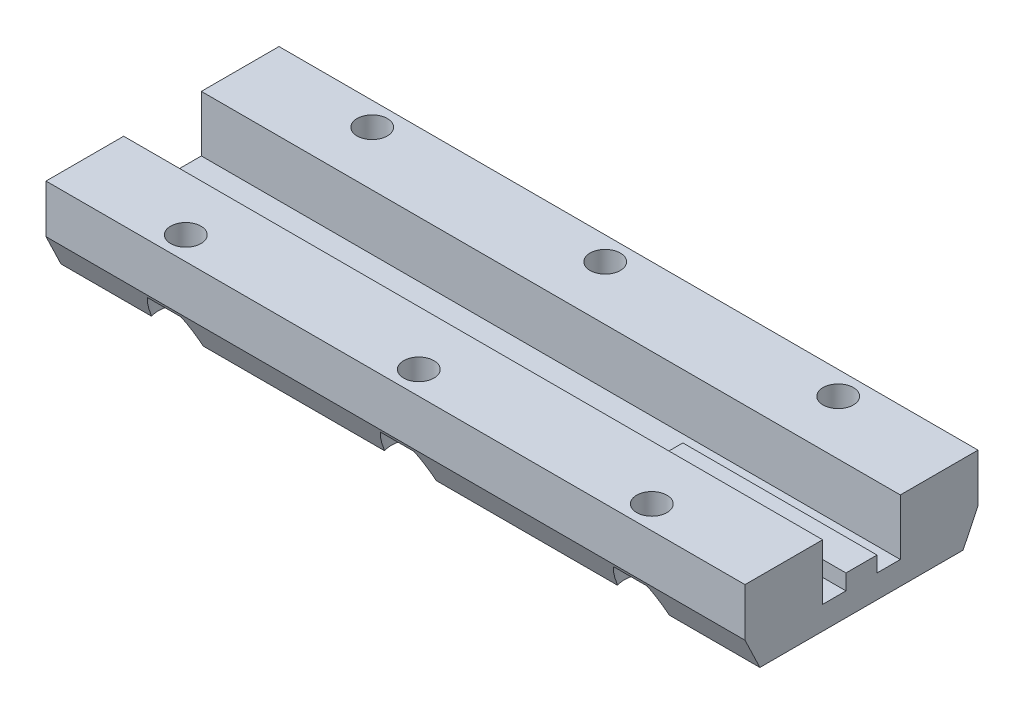
ISO-10303-21;
HEADER;
FILE_DESCRIPTION(('STEP AP214'),'2;1');
FILE_NAME('part.step','',(''),(''),'','','');
FILE_SCHEMA(('AUTOMOTIVE_DESIGN { 1 0 10303 214 1 1 1 1 }'));
ENDSEC;
DATA;
#1=APPLICATION_CONTEXT('core data for automotive mechanical design processes');
#2=APPLICATION_PROTOCOL_DEFINITION('international standard','automotive_design',2000,#1);
#3=PRODUCT_CONTEXT('',#1,'mechanical');
#4=PRODUCT('Part','Part','',(#3));
#5=PRODUCT_RELATED_PRODUCT_CATEGORY('part','',(#4));
#6=PRODUCT_DEFINITION_FORMATION('','',#4);
#7=PRODUCT_DEFINITION_CONTEXT('part definition',#1,'design');
#8=PRODUCT_DEFINITION('design','',#6,#7);
#9=PRODUCT_DEFINITION_SHAPE('','',#8);
#10=(LENGTH_UNIT() NAMED_UNIT(*) SI_UNIT(.MILLI.,.METRE.));
#11=(NAMED_UNIT(*) PLANE_ANGLE_UNIT() SI_UNIT($,.RADIAN.));
#12=(NAMED_UNIT(*) SI_UNIT($,.STERADIAN.) SOLID_ANGLE_UNIT());
#13=UNCERTAINTY_MEASURE_WITH_UNIT(LENGTH_MEASURE(1.E-05),#10,'distance_accuracy_value','');
#14=(GEOMETRIC_REPRESENTATION_CONTEXT(3) GLOBAL_UNCERTAINTY_ASSIGNED_CONTEXT((#13)) GLOBAL_UNIT_ASSIGNED_CONTEXT((#10,
#11,#12)) REPRESENTATION_CONTEXT('',''));
#15=CARTESIAN_POINT('',(0.,0.,0.));
#16=DIRECTION('',(0.,0.,1.));
#17=DIRECTION('',(1.,0.,0.));
#18=AXIS2_PLACEMENT_3D('',#15,#16,#17);
#19=CARTESIAN_POINT('',(45.,0.,-12.));
#20=DIRECTION('',(0.,-1.,0.));
#21=DIRECTION('',(0.,0.,-1.));
#22=AXIS2_PLACEMENT_3D('',#19,#20,#21);
#23=CYLINDRICAL_SURFACE('',#22,1.95);
#24=CARTESIAN_POINT('',(45.,0.,-12.));
#25=DIRECTION('',(0.,-1.,0.));
#26=DIRECTION('',(0.,0.,-1.));
#27=AXIS2_PLACEMENT_3D('',#24,#25,#26);
#28=CIRCLE('',#27,1.95);
#29=CARTESIAN_POINT('',(45.,0.,-13.95));
#30=VERTEX_POINT('',#29);
#31=EDGE_CURVE('E451',#30,#30,#28,.F.);
#32=ORIENTED_EDGE('',*,*,#31,.T.);
#33=EDGE_LOOP('',(#32));
#34=FACE_BOUND('',#33,.T.);
#35=CARTESIAN_POINT('',(45.,-6.7,-12.));
#36=DIRECTION('',(0.,-1.,0.));
#37=DIRECTION('',(0.,0.,-1.));
#38=AXIS2_PLACEMENT_3D('',#35,#36,#37);
#39=CIRCLE('',#38,1.95);
#40=CARTESIAN_POINT('',(45.,-6.7,-13.95));
#41=VERTEX_POINT('',#40);
#42=EDGE_CURVE('E37',#41,#41,#39,.T.);
#43=ORIENTED_EDGE('',*,*,#42,.T.);
#44=EDGE_LOOP('',(#43));
#45=FACE_BOUND('',#44,.T.);
#46=ADVANCED_FACE('F33',(#34,#45),#23,.F.);
#47=CARTESIAN_POINT('',(75.,0.,-12.));
#48=DIRECTION('',(0.,-1.,0.));
#49=DIRECTION('',(0.,0.,-1.));
#50=AXIS2_PLACEMENT_3D('',#47,#48,#49);
#51=CYLINDRICAL_SURFACE('',#50,1.95);
#52=CARTESIAN_POINT('',(75.,0.,-12.));
#53=DIRECTION('',(0.,-1.,0.));
#54=DIRECTION('',(0.,0.,-1.));
#55=AXIS2_PLACEMENT_3D('',#52,#53,#54);
#56=CIRCLE('',#55,1.95);
#57=CARTESIAN_POINT('',(75.,0.,-13.95));
#58=VERTEX_POINT('',#57);
#59=EDGE_CURVE('E446',#58,#58,#56,.F.);
#60=ORIENTED_EDGE('',*,*,#59,.T.);
#61=EDGE_LOOP('',(#60));
#62=FACE_BOUND('',#61,.T.);
#63=CARTESIAN_POINT('',(75.,-6.7,-12.));
#64=DIRECTION('',(0.,-1.,0.));
#65=DIRECTION('',(0.,0.,-1.));
#66=AXIS2_PLACEMENT_3D('',#63,#64,#65);
#67=CIRCLE('',#66,1.95);
#68=CARTESIAN_POINT('',(75.,-6.7,-13.95));
#69=VERTEX_POINT('',#68);
#70=EDGE_CURVE('E314',#69,#69,#67,.T.);
#71=ORIENTED_EDGE('',*,*,#70,.T.);
#72=EDGE_LOOP('',(#71));
#73=FACE_BOUND('',#72,.T.);
#74=ADVANCED_FACE('F518',(#62,#73),#51,.F.);
#75=CARTESIAN_POINT('',(75.,0.,12.));
#76=DIRECTION('',(0.,-1.,0.));
#77=DIRECTION('',(0.,0.,-1.));
#78=AXIS2_PLACEMENT_3D('',#75,#76,#77);
#79=CYLINDRICAL_SURFACE('',#78,1.95);
#80=CARTESIAN_POINT('',(75.,0.,12.));
#81=DIRECTION('',(0.,-1.,0.));
#82=DIRECTION('',(0.,0.,-1.));
#83=AXIS2_PLACEMENT_3D('',#80,#81,#82);
#84=CIRCLE('',#83,1.95);
#85=CARTESIAN_POINT('',(75.,0.,10.05));
#86=VERTEX_POINT('',#85);
#87=EDGE_CURVE('E359',#86,#86,#84,.T.);
#88=ORIENTED_EDGE('',*,*,#87,.F.);
#89=EDGE_LOOP('',(#88));
#90=FACE_BOUND('',#89,.T.);
#91=CARTESIAN_POINT('',(75.,-6.7,12.));
#92=DIRECTION('',(0.,-1.,0.));
#93=DIRECTION('',(0.,0.,-1.));
#94=AXIS2_PLACEMENT_3D('',#91,#92,#93);
#95=CIRCLE('',#94,1.95);
#96=CARTESIAN_POINT('',(75.,-6.7,10.05));
#97=VERTEX_POINT('',#96);
#98=EDGE_CURVE('E309',#97,#97,#95,.F.);
#99=ORIENTED_EDGE('',*,*,#98,.F.);
#100=EDGE_LOOP('',(#99));
#101=FACE_BOUND('',#100,.T.);
#102=ADVANCED_FACE('F524',(#90,#101),#79,.F.);
#103=CARTESIAN_POINT('',(45.,0.,12.));
#104=DIRECTION('',(0.,-1.,0.));
#105=DIRECTION('',(0.,0.,-1.));
#106=AXIS2_PLACEMENT_3D('',#103,#104,#105);
#107=CYLINDRICAL_SURFACE('',#106,1.95);
#108=CARTESIAN_POINT('',(45.,0.,12.));
#109=DIRECTION('',(0.,-1.,0.));
#110=DIRECTION('',(0.,0.,-1.));
#111=AXIS2_PLACEMENT_3D('',#108,#109,#110);
#112=CIRCLE('',#111,1.95);
#113=CARTESIAN_POINT('',(45.,0.,10.05));
#114=VERTEX_POINT('',#113);
#115=EDGE_CURVE('E354',#114,#114,#112,.T.);
#116=ORIENTED_EDGE('',*,*,#115,.F.);
#117=EDGE_LOOP('',(#116));
#118=FACE_BOUND('',#117,.T.);
#119=CARTESIAN_POINT('',(45.,-6.7,12.));
#120=DIRECTION('',(0.,-1.,0.));
#121=DIRECTION('',(0.,0.,-1.));
#122=AXIS2_PLACEMENT_3D('',#119,#120,#121);
#123=CIRCLE('',#122,1.95);
#124=CARTESIAN_POINT('',(45.,-6.7,10.05));
#125=VERTEX_POINT('',#124);
#126=EDGE_CURVE('E300',#125,#125,#123,.F.);
#127=ORIENTED_EDGE('',*,*,#126,.F.);
#128=EDGE_LOOP('',(#127));
#129=FACE_BOUND('',#128,.T.);
#130=ADVANCED_FACE('F567',(#118,#129),#107,.F.);
#131=CARTESIAN_POINT('',(15.,0.,-12.));
#132=DIRECTION('',(0.,-1.,0.));
#133=DIRECTION('',(0.,0.,-1.));
#134=AXIS2_PLACEMENT_3D('',#131,#132,#133);
#135=CYLINDRICAL_SURFACE('',#134,1.95);
#136=CARTESIAN_POINT('',(15.,0.,-12.));
#137=DIRECTION('',(0.,-1.,0.));
#138=DIRECTION('',(0.,0.,-1.));
#139=AXIS2_PLACEMENT_3D('',#136,#137,#138);
#140=CIRCLE('',#139,1.95);
#141=CARTESIAN_POINT('',(15.,0.,-13.95));
#142=VERTEX_POINT('',#141);
#143=EDGE_CURVE('E447',#142,#142,#140,.F.);
#144=ORIENTED_EDGE('',*,*,#143,.T.);
#145=EDGE_LOOP('',(#144));
#146=FACE_BOUND('',#145,.T.);
#147=CARTESIAN_POINT('',(15.,-6.7,-12.));
#148=DIRECTION('',(0.,-1.,0.));
#149=DIRECTION('',(0.,0.,-1.));
#150=AXIS2_PLACEMENT_3D('',#147,#148,#149);
#151=CIRCLE('',#150,1.95);
#152=CARTESIAN_POINT('',(15.,-6.7,-13.95));
#153=VERTEX_POINT('',#152);
#154=EDGE_CURVE('E295',#153,#153,#151,.T.);
#155=ORIENTED_EDGE('',*,*,#154,.T.);
#156=EDGE_LOOP('',(#155));
#157=FACE_BOUND('',#156,.T.);
#158=ADVANCED_FACE('F529',(#146,#157),#135,.F.);
#159=CARTESIAN_POINT('',(15.,0.,12.));
#160=DIRECTION('',(0.,-1.,0.));
#161=DIRECTION('',(0.,0.,-1.));
#162=AXIS2_PLACEMENT_3D('',#159,#160,#161);
#163=CYLINDRICAL_SURFACE('',#162,1.95);
#164=CARTESIAN_POINT('',(15.,0.,12.));
#165=DIRECTION('',(0.,-1.,0.));
#166=DIRECTION('',(0.,0.,-1.));
#167=AXIS2_PLACEMENT_3D('',#164,#165,#166);
#168=CIRCLE('',#167,1.95);
#169=CARTESIAN_POINT('',(15.,0.,10.05));
#170=VERTEX_POINT('',#169);
#171=EDGE_CURVE('E355',#170,#170,#168,.T.);
#172=ORIENTED_EDGE('',*,*,#171,.F.);
#173=EDGE_LOOP('',(#172));
#174=FACE_BOUND('',#173,.T.);
#175=CARTESIAN_POINT('',(15.,-6.7,12.));
#176=DIRECTION('',(0.,-1.,0.));
#177=DIRECTION('',(0.,0.,-1.));
#178=AXIS2_PLACEMENT_3D('',#175,#176,#177);
#179=CIRCLE('',#178,1.95);
#180=CARTESIAN_POINT('',(15.,-6.7,10.05));
#181=VERTEX_POINT('',#180);
#182=EDGE_CURVE('E287',#181,#181,#179,.F.);
#183=ORIENTED_EDGE('',*,*,#182,.F.);
#184=EDGE_LOOP('',(#183));
#185=FACE_BOUND('',#184,.T.);
#186=ADVANCED_FACE('F566',(#174,#185),#163,.F.);
#187=CARTESIAN_POINT('',(65.,-5.2,2.));
#188=DIRECTION('',(1.,0.,0.));
#189=DIRECTION('',(0.,0.,-1.));
#190=AXIS2_PLACEMENT_3D('',#187,#188,#189);
#191=PLANE('',#190);
#192=DIRECTION('',(0.,-1.,0.));
#193=VECTOR('',#192,1.);
#194=CARTESIAN_POINT('',(65.,-5.2,1.95));
#195=LINE('',#194,#193);
#196=CARTESIAN_POINT('',(65.,-7.2,1.95));
#197=VERTEX_POINT('',#196);
#198=CARTESIAN_POINT('',(65.,-10.2,1.95));
#199=VERTEX_POINT('',#198);
#200=EDGE_CURVE('E283',#197,#199,#195,.T.);
#201=ORIENTED_EDGE('',*,*,#200,.F.);
#202=DIRECTION('',(0.,0.,-1.));
#203=VECTOR('',#202,1.);
#204=CARTESIAN_POINT('',(65.,-7.2,2.));
#205=LINE('',#204,#203);
#206=CARTESIAN_POINT('',(65.,-7.2,2.));
#207=VERTEX_POINT('',#206);
#208=EDGE_CURVE('E414',#207,#197,#205,.T.);
#209=ORIENTED_EDGE('',*,*,#208,.F.);
#210=DIRECTION('',(0.,-1.,0.));
#211=VECTOR('',#210,1.);
#212=CARTESIAN_POINT('',(65.,-5.2,2.));
#213=LINE('',#212,#211);
#214=CARTESIAN_POINT('',(65.,-5.2,2.));
#215=VERTEX_POINT('',#214);
#216=EDGE_CURVE('E418',#215,#207,#213,.T.);
#217=ORIENTED_EDGE('',*,*,#216,.F.);
#218=DIRECTION('',(0.,0.,-1.));
#219=VECTOR('',#218,1.);
#220=CARTESIAN_POINT('',(65.,-5.2,2.));
#221=LINE('',#220,#219);
#222=CARTESIAN_POINT('',(65.,-5.2,-2.));
#223=VERTEX_POINT('',#222);
#224=EDGE_CURVE('E426',#215,#223,#221,.T.);
#225=ORIENTED_EDGE('',*,*,#224,.T.);
#226=DIRECTION('',(0.,-1.,0.));
#227=VECTOR('',#226,1.);
#228=CARTESIAN_POINT('',(65.,-5.2,-2.));
#229=LINE('',#228,#227);
#230=CARTESIAN_POINT('',(65.,-7.2,-2.));
#231=VERTEX_POINT('',#230);
#232=EDGE_CURVE('E417',#223,#231,#229,.T.);
#233=ORIENTED_EDGE('',*,*,#232,.T.);
#234=DIRECTION('',(0.,0.,1.));
#235=VECTOR('',#234,1.);
#236=CARTESIAN_POINT('',(65.,-7.2,-5.));
#237=LINE('',#236,#235);
#238=CARTESIAN_POINT('',(65.,-7.2,-1.95));
#239=VERTEX_POINT('',#238);
#240=EDGE_CURVE('E444',#231,#239,#237,.T.);
#241=ORIENTED_EDGE('',*,*,#240,.T.);
#242=DIRECTION('',(0.,-1.,0.));
#243=VECTOR('',#242,1.);
#244=CARTESIAN_POINT('',(65.,-7.2,-1.95));
#245=LINE('',#244,#243);
#246=CARTESIAN_POINT('',(65.,-10.2,-1.95));
#247=VERTEX_POINT('',#246);
#248=EDGE_CURVE('E441',#239,#247,#245,.T.);
#249=ORIENTED_EDGE('',*,*,#248,.T.);
#250=DIRECTION('',(0.,0.,-1.));
#251=VECTOR('',#250,1.);
#252=CARTESIAN_POINT('',(65.,-10.2,2.));
#253=LINE('',#252,#251);
#254=EDGE_CURVE('E437',#199,#247,#253,.T.);
#255=ORIENTED_EDGE('',*,*,#254,.F.);
#256=EDGE_LOOP('',(#201,#209,#217,#225,#233,#241,#249,#255));
#257=FACE_BOUND('',#256,.T.);
#258=ADVANCED_FACE('F595',(#257),#191,.F.);
#259=CARTESIAN_POINT('',(0.,0.,2.));
#260=DIRECTION('',(0.,0.,1.));
#261=DIRECTION('',(1.,0.,0.));
#262=AXIS2_PLACEMENT_3D('',#259,#260,#261);
#263=PLANE('',#262);
#264=ORIENTED_EDGE('',*,*,#216,.T.);
#265=DIRECTION('',(1.,0.,0.));
#266=VECTOR('',#265,1.);
#267=CARTESIAN_POINT('',(0.,-7.2,2.));
#268=LINE('',#267,#266);
#269=CARTESIAN_POINT('',(90.,-7.2,2.));
#270=VERTEX_POINT('',#269);
#271=EDGE_CURVE('E280',#207,#270,#268,.T.);
#272=ORIENTED_EDGE('',*,*,#271,.T.);
#273=DIRECTION('',(0.,1.,0.));
#274=VECTOR('',#273,1.);
#275=CARTESIAN_POINT('',(90.,-5.2,2.));
#276=LINE('',#275,#274);
#277=CARTESIAN_POINT('',(90.,-5.2,2.));
#278=VERTEX_POINT('',#277);
#279=EDGE_CURVE('E421',#270,#278,#276,.T.);
#280=ORIENTED_EDGE('',*,*,#279,.T.);
#281=DIRECTION('',(-1.,0.,0.));
#282=VECTOR('',#281,1.);
#283=CARTESIAN_POINT('',(65.,-5.2,2.));
#284=LINE('',#283,#282);
#285=EDGE_CURVE('E424',#278,#215,#284,.T.);
#286=ORIENTED_EDGE('',*,*,#285,.T.);
#287=EDGE_LOOP('',(#264,#272,#280,#286));
#288=FACE_BOUND('',#287,.T.);
#289=ADVANCED_FACE('F549',(#288),#263,.T.);
#290=CARTESIAN_POINT('',(90.,-7.2,-5.));
#291=DIRECTION('',(0.,-1.,0.));
#292=DIRECTION('',(0.,0.,-1.));
#293=AXIS2_PLACEMENT_3D('',#290,#291,#292);
#294=PLANE('',#293);
#295=ORIENTED_EDGE('',*,*,#240,.F.);
#296=DIRECTION('',(-1.,0.,0.));
#297=VECTOR('',#296,1.);
#298=CARTESIAN_POINT('',(90.,-7.2,-2.));
#299=LINE('',#298,#297);
#300=CARTESIAN_POINT('',(90.,-7.2,-2.));
#301=VERTEX_POINT('',#300);
#302=EDGE_CURVE('E439',#301,#231,#299,.T.);
#303=ORIENTED_EDGE('',*,*,#302,.F.);
#304=DIRECTION('',(0.,0.,1.));
#305=VECTOR('',#304,1.);
#306=CARTESIAN_POINT('',(90.,-7.2,-5.));
#307=LINE('',#306,#305);
#308=CARTESIAN_POINT('',(90.,-7.2,-5.));
#309=VERTEX_POINT('',#308);
#310=EDGE_CURVE('E464',#309,#301,#307,.T.);
#311=ORIENTED_EDGE('',*,*,#310,.F.);
#312=DIRECTION('',(-1.,0.,0.));
#313=VECTOR('',#312,1.);
#314=CARTESIAN_POINT('',(90.,-7.2,-5.));
#315=LINE('',#314,#313);
#316=CARTESIAN_POINT('',(0.,-7.2,-5.));
#317=VERTEX_POINT('',#316);
#318=EDGE_CURVE('E269',#309,#317,#315,.T.);
#319=ORIENTED_EDGE('',*,*,#318,.T.);
#320=DIRECTION('',(0.,0.,1.));
#321=VECTOR('',#320,1.);
#322=CARTESIAN_POINT('',(0.,-7.2,-5.));
#323=LINE('',#322,#321);
#324=CARTESIAN_POINT('',(0.,-7.2,-1.95));
#325=VERTEX_POINT('',#324);
#326=EDGE_CURVE('E477',#317,#325,#323,.T.);
#327=ORIENTED_EDGE('',*,*,#326,.T.);
#328=DIRECTION('',(-1.,0.,0.));
#329=VECTOR('',#328,1.);
#330=CARTESIAN_POINT('',(90.,-7.2,-1.95));
#331=LINE('',#330,#329);
#332=EDGE_CURVE('E265',#239,#325,#331,.T.);
#333=ORIENTED_EDGE('',*,*,#332,.F.);
#334=EDGE_LOOP('',(#295,#303,#311,#319,#327,#333));
#335=FACE_BOUND('',#334,.T.);
#336=ADVANCED_FACE('F545',(#335),#294,.F.);
#337=CARTESIAN_POINT('',(90.,-7.2,-1.95));
#338=DIRECTION('',(0.,0.,-1.));
#339=DIRECTION('',(0.,1.,0.));
#340=AXIS2_PLACEMENT_3D('',#337,#338,#339);
#341=PLANE('',#340);
#342=ORIENTED_EDGE('',*,*,#248,.F.);
#343=ORIENTED_EDGE('',*,*,#332,.T.);
#344=DIRECTION('',(0.,-1.,0.));
#345=VECTOR('',#344,1.);
#346=CARTESIAN_POINT('',(0.,-7.2,-1.95));
#347=LINE('',#346,#345);
#348=CARTESIAN_POINT('',(0.,-10.2,-1.95));
#349=VERTEX_POINT('',#348);
#350=EDGE_CURVE('E480',#325,#349,#347,.T.);
#351=ORIENTED_EDGE('',*,*,#350,.T.);
#352=DIRECTION('',(-1.,0.,0.));
#353=VECTOR('',#352,1.);
#354=CARTESIAN_POINT('',(90.,-10.2,-1.95));
#355=LINE('',#354,#353);
#356=EDGE_CURVE('E262',#247,#349,#355,.T.);
#357=ORIENTED_EDGE('',*,*,#356,.F.);
#358=EDGE_LOOP('',(#342,#343,#351,#357));
#359=FACE_BOUND('',#358,.T.);
#360=ADVANCED_FACE('F539',(#359),#341,.F.);
#361=CARTESIAN_POINT('',(90.,-10.2,-13.0811365520714));
#362=DIRECTION('',(0.,0.432522842970461,0.901622975699239));
#363=DIRECTION('',(0.,-0.901622975699239,0.432522842970461));
#364=AXIS2_PLACEMENT_3D('',#361,#362,#363);
#365=PLANE('',#364);
#366=DIRECTION('',(-1.,0.,0.));
#367=VECTOR('',#366,1.);
#368=CARTESIAN_POINT('',(90.,-10.2,-13.0811365520714));
#369=LINE('',#368,#367);
#370=CARTESIAN_POINT('',(71.6711648049543,-10.2,-13.0811365520714));
#371=VERTEX_POINT('',#370);
#372=CARTESIAN_POINT('',(48.3288351950457,-10.2,-13.0811365520714));
#373=VERTEX_POINT('',#372);
#374=EDGE_CURVE('E254',#371,#373,#369,.T.);
#375=ORIENTED_EDGE('',*,*,#374,.T.);
#376=CARTESIAN_POINT('',(45.,-12.4537019051325,-12.));
#377=DIRECTION('',(0.,0.432522842970461,0.901622975699239));
#378=DIRECTION('',(0.,-0.901622975699239,0.432522842970461));
#379=AXIS2_PLACEMENT_3D('',#376,#377,#378);
#380=ELLIPSE('',#379,8.09205815804514,3.5);
#381=CARTESIAN_POINT('',(47.1521188998025,-6.7,-14.7601420690089));
#382=VERTEX_POINT('',#381);
#383=EDGE_CURVE('E50',#373,#382,#380,.T.);
#384=ORIENTED_EDGE('',*,*,#383,.T.);
#385=DIRECTION('',(1.,0.,0.));
#386=VECTOR('',#385,1.);
#387=CARTESIAN_POINT('',(90.,-6.7,-14.7601420690089));
#388=LINE('',#387,#386);
#389=CARTESIAN_POINT('',(42.8478811001975,-6.7,-14.7601420690089));
#390=VERTEX_POINT('',#389);
#391=EDGE_CURVE('E248',#390,#382,#388,.T.);
#392=ORIENTED_EDGE('',*,*,#391,.F.);
#393=CARTESIAN_POINT('',(41.6711648049543,-10.2,-13.0811365520714));
#394=VERTEX_POINT('',#393);
#395=EDGE_CURVE('E234',#390,#394,#380,.T.);
#396=ORIENTED_EDGE('',*,*,#395,.T.);
#397=CARTESIAN_POINT('',(18.3288351950457,-10.2,-13.0811365520714));
#398=VERTEX_POINT('',#397);
#399=EDGE_CURVE('E246',#394,#398,#369,.T.);
#400=ORIENTED_EDGE('',*,*,#399,.T.);
#401=CARTESIAN_POINT('',(15.,-12.4537019051325,-12.));
#402=DIRECTION('',(0.,0.432522842970461,0.901622975699239));
#403=DIRECTION('',(0.,-0.901622975699239,0.432522842970461));
#404=AXIS2_PLACEMENT_3D('',#401,#402,#403);
#405=ELLIPSE('',#404,8.09205815804514,3.5);
#406=CARTESIAN_POINT('',(17.1521188998025,-6.7,-14.7601420690089));
#407=VERTEX_POINT('',#406);
#408=EDGE_CURVE('E348',#398,#407,#405,.T.);
#409=ORIENTED_EDGE('',*,*,#408,.T.);
#410=DIRECTION('',(1.,0.,0.));
#411=VECTOR('',#410,1.);
#412=CARTESIAN_POINT('',(90.,-6.7,-14.7601420690089));
#413=LINE('',#412,#411);
#414=CARTESIAN_POINT('',(12.8478811001975,-6.7,-14.7601420690089));
#415=VERTEX_POINT('',#414);
#416=EDGE_CURVE('E298',#415,#407,#413,.T.);
#417=ORIENTED_EDGE('',*,*,#416,.F.);
#418=CARTESIAN_POINT('',(11.6711648049543,-10.2,-13.0811365520714));
#419=VERTEX_POINT('',#418);
#420=EDGE_CURVE('E345',#415,#419,#405,.T.);
#421=ORIENTED_EDGE('',*,*,#420,.T.);
#422=CARTESIAN_POINT('',(0.,-10.2,-13.0811365520714));
#423=VERTEX_POINT('',#422);
#424=EDGE_CURVE('E255',#419,#423,#369,.T.);
#425=ORIENTED_EDGE('',*,*,#424,.T.);
#426=DIRECTION('',(0.,0.901622975699239,-0.432522842970461));
#427=VECTOR('',#426,1.);
#428=CARTESIAN_POINT('',(0.,-10.2,-13.0811365520714));
#429=LINE('',#428,#427);
#430=CARTESIAN_POINT('',(0.,-6.2,-15.));
#431=VERTEX_POINT('',#430);
#432=EDGE_CURVE('E460',#423,#431,#429,.T.);
#433=ORIENTED_EDGE('',*,*,#432,.T.);
#434=DIRECTION('',(-1.,0.,0.));
#435=VECTOR('',#434,1.);
#436=CARTESIAN_POINT('',(90.,-6.2,-15.));
#437=LINE('',#436,#435);
#438=CARTESIAN_POINT('',(90.,-6.2,-15.));
#439=VERTEX_POINT('',#438);
#440=EDGE_CURVE('E258',#439,#431,#437,.T.);
#441=ORIENTED_EDGE('',*,*,#440,.F.);
#442=DIRECTION('',(0.,0.901622975699239,-0.432522842970461));
#443=VECTOR('',#442,1.);
#444=CARTESIAN_POINT('',(90.,-10.2,-13.0811365520714));
#445=LINE('',#444,#443);
#446=CARTESIAN_POINT('',(90.,-10.2,-13.0811365520714));
#447=VERTEX_POINT('',#446);
#448=EDGE_CURVE('E469',#447,#439,#445,.T.);
#449=ORIENTED_EDGE('',*,*,#448,.F.);
#450=CARTESIAN_POINT('',(78.3288351950457,-10.2,-13.0811365520714));
#451=VERTEX_POINT('',#450);
#452=EDGE_CURVE('E257',#447,#451,#369,.T.);
#453=ORIENTED_EDGE('',*,*,#452,.T.);
#454=CARTESIAN_POINT('',(75.,-12.4537019051325,-12.));
#455=DIRECTION('',(0.,0.432522842970461,0.901622975699239));
#456=DIRECTION('',(0.,-0.901622975699239,0.432522842970461));
#457=AXIS2_PLACEMENT_3D('',#454,#455,#456);
#458=ELLIPSE('',#457,8.09205815804516,3.50000000000001);
#459=CARTESIAN_POINT('',(77.1521188998025,-6.7,-14.7601420690089));
#460=VERTEX_POINT('',#459);
#461=EDGE_CURVE('E58',#451,#460,#458,.T.);
#462=ORIENTED_EDGE('',*,*,#461,.T.);
#463=DIRECTION('',(1.,0.,0.));
#464=VECTOR('',#463,1.);
#465=CARTESIAN_POINT('',(90.,-6.7,-14.7601420690089));
#466=LINE('',#465,#464);
#467=CARTESIAN_POINT('',(72.8478811001975,-6.7,-14.7601420690089));
#468=VERTEX_POINT('',#467);
#469=EDGE_CURVE('E316',#468,#460,#466,.T.);
#470=ORIENTED_EDGE('',*,*,#469,.F.);
#471=EDGE_CURVE('E320',#468,#371,#458,.T.);
#472=ORIENTED_EDGE('',*,*,#471,.T.);
#473=EDGE_LOOP('',(#375,#384,#392,#396,#400,#409,#417,#421,#425,#433,#441,#449,#453,#462,#470,#472));
#474=FACE_BOUND('',#473,.T.);
#475=ADVANCED_FACE('F244',(#474),#365,.F.);
#476=CARTESIAN_POINT('',(90.,0.,-15.));
#477=DIRECTION('',(0.,0.,1.));
#478=DIRECTION('',(1.,0.,0.));
#479=AXIS2_PLACEMENT_3D('',#476,#477,#478);
#480=PLANE('',#479);
#481=DIRECTION('',(0.,1.,0.));
#482=VECTOR('',#481,1.);
#483=CARTESIAN_POINT('',(0.,0.,-15.));
#484=LINE('',#483,#482);
#485=CARTESIAN_POINT('',(0.,0.,-15.));
#486=VERTEX_POINT('',#485);
#487=EDGE_CURVE('E450',#431,#486,#484,.T.);
#488=ORIENTED_EDGE('',*,*,#487,.T.);
#489=DIRECTION('',(-1.,0.,0.));
#490=VECTOR('',#489,1.);
#491=CARTESIAN_POINT('',(90.,0.,-15.));
#492=LINE('',#491,#490);
#493=CARTESIAN_POINT('',(90.,0.,-15.));
#494=VERTEX_POINT('',#493);
#495=EDGE_CURVE('E277',#494,#486,#492,.T.);
#496=ORIENTED_EDGE('',*,*,#495,.F.);
#497=DIRECTION('',(0.,1.,0.));
#498=VECTOR('',#497,1.);
#499=CARTESIAN_POINT('',(90.,0.,-15.));
#500=LINE('',#499,#498);
#501=EDGE_CURVE('E456',#439,#494,#500,.T.);
#502=ORIENTED_EDGE('',*,*,#501,.F.);
#503=ORIENTED_EDGE('',*,*,#440,.T.);
#504=EDGE_LOOP('',(#488,#496,#502,#503));
#505=FACE_BOUND('',#504,.T.);
#506=ADVANCED_FACE('F35',(#505),#480,.F.);
#507=CARTESIAN_POINT('',(90.,0.,-15.));
#508=DIRECTION('',(0.,-1.,0.));
#509=DIRECTION('',(0.,0.,-1.));
#510=AXIS2_PLACEMENT_3D('',#507,#508,#509);
#511=PLANE('',#510);
#512=ORIENTED_EDGE('',*,*,#143,.F.);
#513=EDGE_LOOP('',(#512));
#514=FACE_BOUND('',#513,.T.);
#515=ORIENTED_EDGE('',*,*,#31,.F.);
#516=EDGE_LOOP('',(#515));
#517=FACE_BOUND('',#516,.T.);
#518=ORIENTED_EDGE('',*,*,#59,.F.);
#519=EDGE_LOOP('',(#518));
#520=FACE_BOUND('',#519,.T.);
#521=DIRECTION('',(0.,0.,1.));
#522=VECTOR('',#521,1.);
#523=CARTESIAN_POINT('',(0.,0.,-15.));
#524=LINE('',#523,#522);
#525=CARTESIAN_POINT('',(0.,0.,-5.));
#526=VERTEX_POINT('',#525);
#527=EDGE_CURVE('E473',#486,#526,#524,.T.);
#528=ORIENTED_EDGE('',*,*,#527,.T.);
#529=DIRECTION('',(-1.,0.,0.));
#530=VECTOR('',#529,1.);
#531=CARTESIAN_POINT('',(90.,0.,-5.));
#532=LINE('',#531,#530);
#533=CARTESIAN_POINT('',(90.,0.,-5.));
#534=VERTEX_POINT('',#533);
#535=EDGE_CURVE('E274',#534,#526,#532,.T.);
#536=ORIENTED_EDGE('',*,*,#535,.F.);
#537=DIRECTION('',(0.,0.,1.));
#538=VECTOR('',#537,1.);
#539=CARTESIAN_POINT('',(90.,0.,-15.));
#540=LINE('',#539,#538);
#541=EDGE_CURVE('E459',#494,#534,#540,.T.);
#542=ORIENTED_EDGE('',*,*,#541,.F.);
#543=ORIENTED_EDGE('',*,*,#495,.T.);
#544=EDGE_LOOP('',(#528,#536,#542,#543));
#545=FACE_BOUND('',#544,.T.);
#546=ADVANCED_FACE('F498',(#514,#517,#520,#545),#511,.F.);
#547=CARTESIAN_POINT('',(90.,0.,-5.));
#548=DIRECTION('',(0.,0.,-1.));
#549=DIRECTION('',(0.,1.,0.));
#550=AXIS2_PLACEMENT_3D('',#547,#548,#549);
#551=PLANE('',#550);
#552=DIRECTION('',(0.,-1.,0.));
#553=VECTOR('',#552,1.);
#554=CARTESIAN_POINT('',(0.,0.,-5.));
#555=LINE('',#554,#553);
#556=EDGE_CURVE('E475',#526,#317,#555,.T.);
#557=ORIENTED_EDGE('',*,*,#556,.T.);
#558=ORIENTED_EDGE('',*,*,#318,.F.);
#559=DIRECTION('',(0.,-1.,0.));
#560=VECTOR('',#559,1.);
#561=CARTESIAN_POINT('',(90.,0.,-5.));
#562=LINE('',#561,#560);
#563=EDGE_CURVE('E462',#534,#309,#562,.T.);
#564=ORIENTED_EDGE('',*,*,#563,.F.);
#565=ORIENTED_EDGE('',*,*,#535,.T.);
#566=EDGE_LOOP('',(#557,#558,#564,#565));
#567=FACE_BOUND('',#566,.T.);
#568=ADVANCED_FACE('F542',(#567),#551,.F.);
#569=CARTESIAN_POINT('',(90.,-10.2,-1.95));
#570=DIRECTION('',(0.,1.,0.));
#571=DIRECTION('',(0.,0.,1.));
#572=AXIS2_PLACEMENT_3D('',#569,#570,#571);
#573=PLANE('',#572);
#574=ORIENTED_EDGE('',*,*,#399,.F.);
#575=CARTESIAN_POINT('',(45.,-10.2,-12.));
#576=DIRECTION('',(0.,-1.,0.));
#577=DIRECTION('',(0.,0.,-1.));
#578=AXIS2_PLACEMENT_3D('',#575,#576,#577);
#579=CIRCLE('',#578,3.5);
#580=EDGE_CURVE('E231',#373,#394,#579,.T.);
#581=ORIENTED_EDGE('',*,*,#580,.F.);
#582=ORIENTED_EDGE('',*,*,#374,.F.);
#583=CARTESIAN_POINT('',(75.,-10.2,-12.));
#584=DIRECTION('',(0.,-1.,0.));
#585=DIRECTION('',(0.,0.,-1.));
#586=AXIS2_PLACEMENT_3D('',#583,#584,#585);
#587=CIRCLE('',#586,3.50000000000001);
#588=EDGE_CURVE('E323',#451,#371,#587,.T.);
#589=ORIENTED_EDGE('',*,*,#588,.F.);
#590=ORIENTED_EDGE('',*,*,#452,.F.);
#591=DIRECTION('',(0.,0.,-1.));
#592=VECTOR('',#591,1.);
#593=CARTESIAN_POINT('',(90.,-10.2,-1.95));
#594=LINE('',#593,#592);
#595=CARTESIAN_POINT('',(90.,-10.2,13.0811365520714));
#596=VERTEX_POINT('',#595);
#597=EDGE_CURVE('E467',#596,#447,#594,.T.);
#598=ORIENTED_EDGE('',*,*,#597,.F.);
#599=DIRECTION('',(-1.,0.,0.));
#600=VECTOR('',#599,1.);
#601=CARTESIAN_POINT('',(90.,-10.2,13.0811365520714));
#602=LINE('',#601,#600);
#603=CARTESIAN_POINT('',(78.3288351950457,-10.2,13.0811365520714));
#604=VERTEX_POINT('',#603);
#605=EDGE_CURVE('E404',#596,#604,#602,.T.);
#606=ORIENTED_EDGE('',*,*,#605,.T.);
#607=CARTESIAN_POINT('',(75.,-10.2,12.));
#608=DIRECTION('',(0.,-1.,0.));
#609=DIRECTION('',(0.,0.,-1.));
#610=AXIS2_PLACEMENT_3D('',#607,#608,#609);
#611=CIRCLE('',#610,3.50000000000001);
#612=CARTESIAN_POINT('',(71.6711648049543,-10.2,13.0811365520714));
#613=VERTEX_POINT('',#612);
#614=EDGE_CURVE('E333',#613,#604,#611,.T.);
#615=ORIENTED_EDGE('',*,*,#614,.F.);
#616=CARTESIAN_POINT('',(48.3288351950457,-10.2,13.0811365520714));
#617=VERTEX_POINT('',#616);
#618=EDGE_CURVE('E408',#613,#617,#602,.T.);
#619=ORIENTED_EDGE('',*,*,#618,.T.);
#620=CARTESIAN_POINT('',(45.,-10.2,12.));
#621=DIRECTION('',(0.,-1.,0.));
#622=DIRECTION('',(0.,0.,-1.));
#623=AXIS2_PLACEMENT_3D('',#620,#621,#622);
#624=CIRCLE('',#623,3.5);
#625=CARTESIAN_POINT('',(41.6711648049543,-10.2,13.0811365520714));
#626=VERTEX_POINT('',#625);
#627=EDGE_CURVE('E336',#626,#617,#624,.T.);
#628=ORIENTED_EDGE('',*,*,#627,.F.);
#629=CARTESIAN_POINT('',(18.3288351950457,-10.2,13.0811365520714));
#630=VERTEX_POINT('',#629);
#631=EDGE_CURVE('E628',#626,#630,#602,.T.);
#632=ORIENTED_EDGE('',*,*,#631,.T.);
#633=CARTESIAN_POINT('',(15.,-10.2,12.));
#634=DIRECTION('',(0.,-1.,0.));
#635=DIRECTION('',(0.,0.,-1.));
#636=AXIS2_PLACEMENT_3D('',#633,#634,#635);
#637=CIRCLE('',#636,3.5);
#638=CARTESIAN_POINT('',(11.6711648049543,-10.2,13.0811365520714));
#639=VERTEX_POINT('',#638);
#640=EDGE_CURVE('E350',#639,#630,#637,.T.);
#641=ORIENTED_EDGE('',*,*,#640,.F.);
#642=CARTESIAN_POINT('',(0.,-10.2,13.0811365520714));
#643=VERTEX_POINT('',#642);
#644=EDGE_CURVE('E403',#639,#643,#602,.T.);
#645=ORIENTED_EDGE('',*,*,#644,.T.);
#646=DIRECTION('',(0.,0.,-1.));
#647=VECTOR('',#646,1.);
#648=CARTESIAN_POINT('',(0.,-10.2,1.95));
#649=LINE('',#648,#647);
#650=CARTESIAN_POINT('',(0.,-10.2,1.95));
#651=VERTEX_POINT('',#650);
#652=EDGE_CURVE('E385',#643,#651,#649,.T.);
#653=ORIENTED_EDGE('',*,*,#652,.T.);
#654=DIRECTION('',(-1.,0.,0.));
#655=VECTOR('',#654,1.);
#656=CARTESIAN_POINT('',(90.,-10.2,1.95));
#657=LINE('',#656,#655);
#658=EDGE_CURVE('E401',#199,#651,#657,.T.);
#659=ORIENTED_EDGE('',*,*,#658,.F.);
#660=ORIENTED_EDGE('',*,*,#254,.T.);
#661=ORIENTED_EDGE('',*,*,#356,.T.);
#662=DIRECTION('',(0.,0.,-1.));
#663=VECTOR('',#662,1.);
#664=CARTESIAN_POINT('',(0.,-10.2,-1.95));
#665=LINE('',#664,#663);
#666=EDGE_CURVE('E482',#349,#423,#665,.T.);
#667=ORIENTED_EDGE('',*,*,#666,.T.);
#668=ORIENTED_EDGE('',*,*,#424,.F.);
#669=CARTESIAN_POINT('',(15.,-10.2,-12.));
#670=DIRECTION('',(0.,-1.,0.));
#671=DIRECTION('',(0.,0.,-1.));
#672=AXIS2_PLACEMENT_3D('',#669,#670,#671);
#673=CIRCLE('',#672,3.5);
#674=EDGE_CURVE('E253',#398,#419,#673,.T.);
#675=ORIENTED_EDGE('',*,*,#674,.F.);
#676=EDGE_LOOP('',(#574,#581,#582,#589,#590,#598,#606,#615,#619,#628,#632,#641,#645,#653,#659,
#660,#661,#667,#668,#675));
#677=FACE_BOUND('',#676,.T.);
#678=ADVANCED_FACE('F251',(#677),#573,.F.);
#679=CARTESIAN_POINT('',(90.,0.,0.));
#680=DIRECTION('',(1.,0.,0.));
#681=DIRECTION('',(0.,0.,-1.));
#682=AXIS2_PLACEMENT_3D('',#679,#680,#681);
#683=PLANE('',#682);
#684=ORIENTED_EDGE('',*,*,#597,.T.);
#685=ORIENTED_EDGE('',*,*,#448,.T.);
#686=ORIENTED_EDGE('',*,*,#501,.T.);
#687=ORIENTED_EDGE('',*,*,#541,.T.);
#688=ORIENTED_EDGE('',*,*,#563,.T.);
#689=ORIENTED_EDGE('',*,*,#310,.T.);
#690=DIRECTION('',(0.,1.,0.));
#691=VECTOR('',#690,1.);
#692=CARTESIAN_POINT('',(90.,-5.2,-2.));
#693=LINE('',#692,#691);
#694=CARTESIAN_POINT('',(90.,-5.2,-2.));
#695=VERTEX_POINT('',#694);
#696=EDGE_CURVE('E429',#301,#695,#693,.T.);
#697=ORIENTED_EDGE('',*,*,#696,.T.);
#698=DIRECTION('',(0.,0.,-1.));
#699=VECTOR('',#698,1.);
#700=CARTESIAN_POINT('',(90.,-5.2,2.));
#701=LINE('',#700,#699);
#702=EDGE_CURVE('E434',#278,#695,#701,.T.);
#703=ORIENTED_EDGE('',*,*,#702,.F.);
#704=ORIENTED_EDGE('',*,*,#279,.F.);
#705=DIRECTION('',(0.,0.,1.));
#706=VECTOR('',#705,1.);
#707=CARTESIAN_POINT('',(90.,-7.2,5.));
#708=LINE('',#707,#706);
#709=CARTESIAN_POINT('',(90.,-7.2,5.));
#710=VERTEX_POINT('',#709);
#711=EDGE_CURVE('E373',#270,#710,#708,.T.);
#712=ORIENTED_EDGE('',*,*,#711,.T.);
#713=DIRECTION('',(0.,1.,0.));
#714=VECTOR('',#713,1.);
#715=CARTESIAN_POINT('',(90.,0.,5.));
#716=LINE('',#715,#714);
#717=CARTESIAN_POINT('',(90.,0.,5.));
#718=VERTEX_POINT('',#717);
#719=EDGE_CURVE('E375',#710,#718,#716,.T.);
#720=ORIENTED_EDGE('',*,*,#719,.T.);
#721=DIRECTION('',(0.,0.,1.));
#722=VECTOR('',#721,1.);
#723=CARTESIAN_POINT('',(90.,0.,15.));
#724=LINE('',#723,#722);
#725=CARTESIAN_POINT('',(90.,0.,15.));
#726=VERTEX_POINT('',#725);
#727=EDGE_CURVE('E364',#718,#726,#724,.T.);
#728=ORIENTED_EDGE('',*,*,#727,.T.);
#729=DIRECTION('',(0.,-1.,0.));
#730=VECTOR('',#729,1.);
#731=CARTESIAN_POINT('',(90.,0.,15.));
#732=LINE('',#731,#730);
#733=CARTESIAN_POINT('',(90.,-6.2,15.));
#734=VERTEX_POINT('',#733);
#735=EDGE_CURVE('E367',#726,#734,#732,.T.);
#736=ORIENTED_EDGE('',*,*,#735,.T.);
#737=DIRECTION('',(0.,-0.901622975699238,-0.432522842970462));
#738=VECTOR('',#737,1.);
#739=CARTESIAN_POINT('',(90.,-10.2,13.0811365520714));
#740=LINE('',#739,#738);
#741=EDGE_CURVE('E370',#734,#596,#740,.T.);
#742=ORIENTED_EDGE('',*,*,#741,.T.);
#743=EDGE_LOOP('',(#684,#685,#686,#687,#688,#689,#697,#703,#704,#712,#720,#728,#736,#742));
#744=FACE_BOUND('',#743,.T.);
#745=ADVANCED_FACE('F501',(#744),#683,.T.);
#746=CARTESIAN_POINT('',(0.,0.,0.));
#747=DIRECTION('',(1.,0.,0.));
#748=DIRECTION('',(0.,0.,-1.));
#749=AXIS2_PLACEMENT_3D('',#746,#747,#748);
#750=PLANE('',#749);
#751=ORIENTED_EDGE('',*,*,#487,.F.);
#752=ORIENTED_EDGE('',*,*,#432,.F.);
#753=ORIENTED_EDGE('',*,*,#666,.F.);
#754=ORIENTED_EDGE('',*,*,#350,.F.);
#755=ORIENTED_EDGE('',*,*,#326,.F.);
#756=ORIENTED_EDGE('',*,*,#556,.F.);
#757=ORIENTED_EDGE('',*,*,#527,.F.);
#758=EDGE_LOOP('',(#751,#752,#753,#754,#755,#756,#757));
#759=FACE_BOUND('',#758,.T.);
#760=ADVANCED_FACE('F492',(#759),#750,.F.);
#761=CARTESIAN_POINT('',(0.,0.,-2.));
#762=DIRECTION('',(0.,0.,1.));
#763=DIRECTION('',(1.,0.,0.));
#764=AXIS2_PLACEMENT_3D('',#761,#762,#763);
#765=PLANE('',#764);
#766=ORIENTED_EDGE('',*,*,#696,.F.);
#767=ORIENTED_EDGE('',*,*,#302,.T.);
#768=ORIENTED_EDGE('',*,*,#232,.F.);
#769=DIRECTION('',(-1.,0.,0.));
#770=VECTOR('',#769,1.);
#771=CARTESIAN_POINT('',(65.,-5.2,-2.));
#772=LINE('',#771,#770);
#773=EDGE_CURVE('E422',#695,#223,#772,.T.);
#774=ORIENTED_EDGE('',*,*,#773,.F.);
#775=EDGE_LOOP('',(#766,#767,#768,#774));
#776=FACE_BOUND('',#775,.T.);
#777=ADVANCED_FACE('F536',(#776),#765,.F.);
#778=CARTESIAN_POINT('',(65.,-5.2,2.));
#779=DIRECTION('',(0.,-1.,0.));
#780=DIRECTION('',(0.,0.,-1.));
#781=AXIS2_PLACEMENT_3D('',#778,#779,#780);
#782=PLANE('',#781);
#783=ORIENTED_EDGE('',*,*,#773,.T.);
#784=ORIENTED_EDGE('',*,*,#224,.F.);
#785=ORIENTED_EDGE('',*,*,#285,.F.);
#786=ORIENTED_EDGE('',*,*,#702,.T.);
#787=EDGE_LOOP('',(#783,#784,#785,#786));
#788=FACE_BOUND('',#787,.T.);
#789=ADVANCED_FACE('F591',(#788),#782,.F.);
#790=CARTESIAN_POINT('',(90.,-7.2,1.95));
#791=DIRECTION('',(0.,0.,1.));
#792=DIRECTION('',(0.,-1.,0.));
#793=AXIS2_PLACEMENT_3D('',#790,#791,#792);
#794=PLANE('',#793);
#795=DIRECTION('',(-1.,0.,0.));
#796=VECTOR('',#795,1.);
#797=CARTESIAN_POINT('',(90.,-7.2,1.95));
#798=LINE('',#797,#796);
#799=CARTESIAN_POINT('',(0.,-7.2,1.95));
#800=VERTEX_POINT('',#799);
#801=EDGE_CURVE('E399',#197,#800,#798,.T.);
#802=ORIENTED_EDGE('',*,*,#801,.F.);
#803=ORIENTED_EDGE('',*,*,#200,.T.);
#804=ORIENTED_EDGE('',*,*,#658,.T.);
#805=DIRECTION('',(0.,1.,0.));
#806=VECTOR('',#805,1.);
#807=CARTESIAN_POINT('',(0.,-7.2,1.95));
#808=LINE('',#807,#806);
#809=EDGE_CURVE('E388',#651,#800,#808,.T.);
#810=ORIENTED_EDGE('',*,*,#809,.T.);
#811=EDGE_LOOP('',(#802,#803,#804,#810));
#812=FACE_BOUND('',#811,.T.);
#813=ADVANCED_FACE('F640',(#812),#794,.F.);
#814=CARTESIAN_POINT('',(90.,-7.2,5.));
#815=DIRECTION('',(0.,-1.,0.));
#816=DIRECTION('',(0.,0.,-1.));
#817=AXIS2_PLACEMENT_3D('',#814,#815,#816);
#818=PLANE('',#817);
#819=ORIENTED_EDGE('',*,*,#271,.F.);
#820=ORIENTED_EDGE('',*,*,#208,.T.);
#821=ORIENTED_EDGE('',*,*,#801,.T.);
#822=DIRECTION('',(0.,0.,1.));
#823=VECTOR('',#822,1.);
#824=CARTESIAN_POINT('',(0.,-7.2,5.));
#825=LINE('',#824,#823);
#826=CARTESIAN_POINT('',(0.,-7.2,5.));
#827=VERTEX_POINT('',#826);
#828=EDGE_CURVE('E391',#800,#827,#825,.T.);
#829=ORIENTED_EDGE('',*,*,#828,.T.);
#830=DIRECTION('',(-1.,0.,0.));
#831=VECTOR('',#830,1.);
#832=CARTESIAN_POINT('',(90.,-7.2,5.));
#833=LINE('',#832,#831);
#834=EDGE_CURVE('E396',#710,#827,#833,.T.);
#835=ORIENTED_EDGE('',*,*,#834,.F.);
#836=ORIENTED_EDGE('',*,*,#711,.F.);
#837=EDGE_LOOP('',(#819,#820,#821,#829,#835,#836));
#838=FACE_BOUND('',#837,.T.);
#839=ADVANCED_FACE('F601',(#838),#818,.F.);
#840=CARTESIAN_POINT('',(90.,0.,15.));
#841=DIRECTION('',(0.,-1.,0.));
#842=DIRECTION('',(0.,0.,-1.));
#843=AXIS2_PLACEMENT_3D('',#840,#841,#842);
#844=PLANE('',#843);
#845=ORIENTED_EDGE('',*,*,#171,.T.);
#846=EDGE_LOOP('',(#845));
#847=FACE_BOUND('',#846,.T.);
#848=ORIENTED_EDGE('',*,*,#87,.T.);
#849=EDGE_LOOP('',(#848));
#850=FACE_BOUND('',#849,.T.);
#851=ORIENTED_EDGE('',*,*,#115,.T.);
#852=EDGE_LOOP('',(#851));
#853=FACE_BOUND('',#852,.T.);
#854=DIRECTION('',(0.,0.,1.));
#855=VECTOR('',#854,1.);
#856=CARTESIAN_POINT('',(0.,0.,15.));
#857=LINE('',#856,#855);
#858=CARTESIAN_POINT('',(0.,0.,5.));
#859=VERTEX_POINT('',#858);
#860=CARTESIAN_POINT('',(0.,0.,15.));
#861=VERTEX_POINT('',#860);
#862=EDGE_CURVE('E358',#859,#861,#857,.T.);
#863=ORIENTED_EDGE('',*,*,#862,.T.);
#864=DIRECTION('',(-1.,0.,0.));
#865=VECTOR('',#864,1.);
#866=CARTESIAN_POINT('',(90.,0.,15.));
#867=LINE('',#866,#865);
#868=EDGE_CURVE('E411',#726,#861,#867,.T.);
#869=ORIENTED_EDGE('',*,*,#868,.F.);
#870=ORIENTED_EDGE('',*,*,#727,.F.);
#871=DIRECTION('',(-1.,0.,0.));
#872=VECTOR('',#871,1.);
#873=CARTESIAN_POINT('',(90.,0.,5.));
#874=LINE('',#873,#872);
#875=EDGE_CURVE('E377',#718,#859,#874,.T.);
#876=ORIENTED_EDGE('',*,*,#875,.T.);
#877=EDGE_LOOP('',(#863,#869,#870,#876));
#878=FACE_BOUND('',#877,.T.);
#879=ADVANCED_FACE('F613',(#847,#850,#853,#878),#844,.F.);
#880=CARTESIAN_POINT('',(90.,0.,15.));
#881=DIRECTION('',(0.,0.,-1.));
#882=DIRECTION('',(-1.,0.,0.));
#883=AXIS2_PLACEMENT_3D('',#880,#881,#882);
#884=PLANE('',#883);
#885=DIRECTION('',(0.,-1.,0.));
#886=VECTOR('',#885,1.);
#887=CARTESIAN_POINT('',(0.,0.,15.));
#888=LINE('',#887,#886);
#889=CARTESIAN_POINT('',(0.,-6.2,15.));
#890=VERTEX_POINT('',#889);
#891=EDGE_CURVE('E380',#861,#890,#888,.T.);
#892=ORIENTED_EDGE('',*,*,#891,.T.);
#893=DIRECTION('',(-1.,0.,0.));
#894=VECTOR('',#893,1.);
#895=CARTESIAN_POINT('',(90.,-6.2,15.));
#896=LINE('',#895,#894);
#897=EDGE_CURVE('E407',#734,#890,#896,.T.);
#898=ORIENTED_EDGE('',*,*,#897,.F.);
#899=ORIENTED_EDGE('',*,*,#735,.F.);
#900=ORIENTED_EDGE('',*,*,#868,.T.);
#901=EDGE_LOOP('',(#892,#898,#899,#900));
#902=FACE_BOUND('',#901,.T.);
#903=ADVANCED_FACE('F615',(#902),#884,.F.);
#904=CARTESIAN_POINT('',(90.,-10.2,13.0811365520714));
#905=DIRECTION('',(0.,0.432522842970462,-0.901622975699238));
#906=DIRECTION('',(0.,0.901622975699238,0.432522842970462));
#907=AXIS2_PLACEMENT_3D('',#904,#905,#906);
#908=PLANE('',#907);
#909=ORIENTED_EDGE('',*,*,#618,.F.);
#910=CARTESIAN_POINT('',(75.,-12.4537019051325,12.));
#911=DIRECTION('',(0.,0.432522842970462,-0.901622975699238));
#912=DIRECTION('',(0.,-0.901622975699238,-0.432522842970462));
#913=AXIS2_PLACEMENT_3D('',#910,#911,#912);
#914=ELLIPSE('',#913,8.09205815804515,3.50000000000001);
#915=CARTESIAN_POINT('',(72.8478811001975,-6.7,14.7601420690089));
#916=VERTEX_POINT('',#915);
#917=EDGE_CURVE('E11',#613,#916,#914,.T.);
#918=ORIENTED_EDGE('',*,*,#917,.T.);
#919=DIRECTION('',(-1.,0.,0.));
#920=VECTOR('',#919,1.);
#921=CARTESIAN_POINT('',(90.,-6.7,14.7601420690089));
#922=LINE('',#921,#920);
#923=CARTESIAN_POINT('',(77.1521188998025,-6.7,14.7601420690089));
#924=VERTEX_POINT('',#923);
#925=EDGE_CURVE('E311',#924,#916,#922,.T.);
#926=ORIENTED_EDGE('',*,*,#925,.F.);
#927=EDGE_CURVE('E42',#924,#604,#914,.T.);
#928=ORIENTED_EDGE('',*,*,#927,.T.);
#929=ORIENTED_EDGE('',*,*,#605,.F.);
#930=ORIENTED_EDGE('',*,*,#741,.F.);
#931=ORIENTED_EDGE('',*,*,#897,.T.);
#932=DIRECTION('',(0.,-0.901622975699238,-0.432522842970462));
#933=VECTOR('',#932,1.);
#934=CARTESIAN_POINT('',(0.,-10.2,13.0811365520714));
#935=LINE('',#934,#933);
#936=EDGE_CURVE('E382',#890,#643,#935,.T.);
#937=ORIENTED_EDGE('',*,*,#936,.T.);
#938=ORIENTED_EDGE('',*,*,#644,.F.);
#939=CARTESIAN_POINT('',(15.,-12.4537019051325,12.));
#940=DIRECTION('',(0.,0.432522842970462,-0.901622975699238));
#941=DIRECTION('',(0.,-0.901622975699238,-0.432522842970462));
#942=AXIS2_PLACEMENT_3D('',#939,#940,#941);
#943=ELLIPSE('',#942,8.09205815804514,3.5);
#944=CARTESIAN_POINT('',(12.8478811001975,-6.7,14.7601420690089));
#945=VERTEX_POINT('',#944);
#946=EDGE_CURVE('E294',#639,#945,#943,.T.);
#947=ORIENTED_EDGE('',*,*,#946,.T.);
#948=DIRECTION('',(-1.,0.,0.));
#949=VECTOR('',#948,1.);
#950=CARTESIAN_POINT('',(90.,-6.7,14.7601420690089));
#951=LINE('',#950,#949);
#952=CARTESIAN_POINT('',(17.1521188998025,-6.7,14.7601420690089));
#953=VERTEX_POINT('',#952);
#954=EDGE_CURVE('E290',#953,#945,#951,.T.);
#955=ORIENTED_EDGE('',*,*,#954,.F.);
#956=EDGE_CURVE('E286',#953,#630,#943,.T.);
#957=ORIENTED_EDGE('',*,*,#956,.T.);
#958=ORIENTED_EDGE('',*,*,#631,.F.);
#959=CARTESIAN_POINT('',(45.,-12.4537019051325,12.));
#960=DIRECTION('',(0.,0.432522842970462,-0.901622975699238));
#961=DIRECTION('',(0.,-0.901622975699238,-0.432522842970462));
#962=AXIS2_PLACEMENT_3D('',#959,#960,#961);
#963=ELLIPSE('',#962,8.09205815804514,3.5);
#964=CARTESIAN_POINT('',(42.8478811001975,-6.7,14.7601420690089));
#965=VERTEX_POINT('',#964);
#966=EDGE_CURVE('E308',#626,#965,#963,.T.);
#967=ORIENTED_EDGE('',*,*,#966,.T.);
#968=DIRECTION('',(-1.,0.,0.));
#969=VECTOR('',#968,1.);
#970=CARTESIAN_POINT('',(90.,-6.7,14.7601420690089));
#971=LINE('',#970,#969);
#972=CARTESIAN_POINT('',(47.1521188998025,-6.7,14.7601420690089));
#973=VERTEX_POINT('',#972);
#974=EDGE_CURVE('E303',#973,#965,#971,.T.);
#975=ORIENTED_EDGE('',*,*,#974,.F.);
#976=EDGE_CURVE('E305',#973,#617,#963,.T.);
#977=ORIENTED_EDGE('',*,*,#976,.T.);
#978=EDGE_LOOP('',(#909,#918,#926,#928,#929,#930,#931,#937,#938,#947,#955,#957,#958,#967,#975,#977));
#979=FACE_BOUND('',#978,.T.);
#980=ADVANCED_FACE('F620',(#979),#908,.F.);
#981=CARTESIAN_POINT('',(90.,0.,5.));
#982=DIRECTION('',(0.,0.,1.));
#983=DIRECTION('',(0.,-1.,0.));
#984=AXIS2_PLACEMENT_3D('',#981,#982,#983);
#985=PLANE('',#984);
#986=DIRECTION('',(0.,1.,0.));
#987=VECTOR('',#986,1.);
#988=CARTESIAN_POINT('',(0.,0.,5.));
#989=LINE('',#988,#987);
#990=EDGE_CURVE('E368',#827,#859,#989,.T.);
#991=ORIENTED_EDGE('',*,*,#990,.T.);
#992=ORIENTED_EDGE('',*,*,#875,.F.);
#993=ORIENTED_EDGE('',*,*,#719,.F.);
#994=ORIENTED_EDGE('',*,*,#834,.T.);
#995=EDGE_LOOP('',(#991,#992,#993,#994));
#996=FACE_BOUND('',#995,.T.);
#997=ADVANCED_FACE('F609',(#996),#985,.F.);
#998=CARTESIAN_POINT('',(0.,0.,0.));
#999=DIRECTION('',(-1.,0.,0.));
#1000=DIRECTION('',(0.,0.,1.));
#1001=AXIS2_PLACEMENT_3D('',#998,#999,#1000);
#1002=PLANE('',#1001);
#1003=ORIENTED_EDGE('',*,*,#862,.F.);
#1004=ORIENTED_EDGE('',*,*,#990,.F.);
#1005=ORIENTED_EDGE('',*,*,#828,.F.);
#1006=ORIENTED_EDGE('',*,*,#809,.F.);
#1007=ORIENTED_EDGE('',*,*,#652,.F.);
#1008=ORIENTED_EDGE('',*,*,#936,.F.);
#1009=ORIENTED_EDGE('',*,*,#891,.F.);
#1010=EDGE_LOOP('',(#1003,#1004,#1005,#1006,#1007,#1008,#1009));
#1011=FACE_BOUND('',#1010,.T.);
#1012=ADVANCED_FACE('F637',(#1011),#1002,.T.);
#1013=CARTESIAN_POINT('',(15.,-6.7,12.));
#1014=DIRECTION('',(0.,-1.,0.));
#1015=DIRECTION('',(0.,0.,-1.));
#1016=AXIS2_PLACEMENT_3D('',#1013,#1014,#1015);
#1017=CYLINDRICAL_SURFACE('',#1016,3.5);
#1018=ORIENTED_EDGE('',*,*,#640,.T.);
#1019=ORIENTED_EDGE('',*,*,#956,.F.);
#1020=CARTESIAN_POINT('',(15.,-6.7,12.));
#1021=DIRECTION('',(0.,-1.,0.));
#1022=DIRECTION('',(0.,0.,-1.));
#1023=AXIS2_PLACEMENT_3D('',#1020,#1021,#1022);
#1024=CIRCLE('',#1023,3.5);
#1025=EDGE_CURVE('E291',#945,#953,#1024,.T.);
#1026=ORIENTED_EDGE('',*,*,#1025,.F.);
#1027=ORIENTED_EDGE('',*,*,#946,.F.);
#1028=EDGE_LOOP('',(#1018,#1019,#1026,#1027));
#1029=FACE_BOUND('',#1028,.T.);
#1030=ADVANCED_FACE('F673',(#1029),#1017,.F.);
#1031=CARTESIAN_POINT('',(15.,-6.7,12.));
#1032=DIRECTION('',(0.,-1.,0.));
#1033=DIRECTION('',(0.,0.,-1.));
#1034=AXIS2_PLACEMENT_3D('',#1031,#1032,#1033);
#1035=PLANE('',#1034);
#1036=ORIENTED_EDGE('',*,*,#182,.T.);
#1037=EDGE_LOOP('',(#1036));
#1038=FACE_BOUND('',#1037,.T.);
#1039=ORIENTED_EDGE('',*,*,#954,.T.);
#1040=ORIENTED_EDGE('',*,*,#1025,.T.);
#1041=EDGE_LOOP('',(#1039,#1040));
#1042=FACE_BOUND('',#1041,.T.);
#1043=ADVANCED_FACE('F698',(#1038,#1042),#1035,.T.);
#1044=CARTESIAN_POINT('',(15.,-6.7,-12.));
#1045=DIRECTION('',(0.,-1.,0.));
#1046=DIRECTION('',(0.,0.,-1.));
#1047=AXIS2_PLACEMENT_3D('',#1044,#1045,#1046);
#1048=CYLINDRICAL_SURFACE('',#1047,3.5);
#1049=ORIENTED_EDGE('',*,*,#674,.T.);
#1050=ORIENTED_EDGE('',*,*,#420,.F.);
#1051=CARTESIAN_POINT('',(15.,-6.7,-12.));
#1052=DIRECTION('',(0.,-1.,0.));
#1053=DIRECTION('',(0.,0.,-1.));
#1054=AXIS2_PLACEMENT_3D('',#1051,#1052,#1053);
#1055=CIRCLE('',#1054,3.5);
#1056=EDGE_CURVE('E299',#407,#415,#1055,.T.);
#1057=ORIENTED_EDGE('',*,*,#1056,.F.);
#1058=ORIENTED_EDGE('',*,*,#408,.F.);
#1059=EDGE_LOOP('',(#1049,#1050,#1057,#1058));
#1060=FACE_BOUND('',#1059,.T.);
#1061=ADVANCED_FACE('F574',(#1060),#1048,.F.);
#1062=CARTESIAN_POINT('',(15.,-6.7,-12.));
#1063=DIRECTION('',(0.,-1.,0.));
#1064=DIRECTION('',(0.,0.,-1.));
#1065=AXIS2_PLACEMENT_3D('',#1062,#1063,#1064);
#1066=PLANE('',#1065);
#1067=ORIENTED_EDGE('',*,*,#154,.F.);
#1068=EDGE_LOOP('',(#1067));
#1069=FACE_BOUND('',#1068,.T.);
#1070=ORIENTED_EDGE('',*,*,#416,.T.);
#1071=ORIENTED_EDGE('',*,*,#1056,.T.);
#1072=EDGE_LOOP('',(#1070,#1071));
#1073=FACE_BOUND('',#1072,.T.);
#1074=ADVANCED_FACE('F570',(#1069,#1073),#1066,.T.);
#1075=CARTESIAN_POINT('',(45.,-6.7,12.));
#1076=DIRECTION('',(0.,-1.,0.));
#1077=DIRECTION('',(0.,0.,-1.));
#1078=AXIS2_PLACEMENT_3D('',#1075,#1076,#1077);
#1079=CYLINDRICAL_SURFACE('',#1078,3.5);
#1080=ORIENTED_EDGE('',*,*,#627,.T.);
#1081=ORIENTED_EDGE('',*,*,#976,.F.);
#1082=CARTESIAN_POINT('',(45.,-6.7,12.));
#1083=DIRECTION('',(0.,-1.,0.));
#1084=DIRECTION('',(0.,0.,-1.));
#1085=AXIS2_PLACEMENT_3D('',#1082,#1083,#1084);
#1086=CIRCLE('',#1085,3.5);
#1087=EDGE_CURVE('E304',#965,#973,#1086,.T.);
#1088=ORIENTED_EDGE('',*,*,#1087,.F.);
#1089=ORIENTED_EDGE('',*,*,#966,.F.);
#1090=EDGE_LOOP('',(#1080,#1081,#1088,#1089));
#1091=FACE_BOUND('',#1090,.T.);
#1092=ADVANCED_FACE('F573',(#1091),#1079,.F.);
#1093=CARTESIAN_POINT('',(45.,-6.7,12.));
#1094=DIRECTION('',(0.,-1.,0.));
#1095=DIRECTION('',(0.,0.,-1.));
#1096=AXIS2_PLACEMENT_3D('',#1093,#1094,#1095);
#1097=PLANE('',#1096);
#1098=ORIENTED_EDGE('',*,*,#126,.T.);
#1099=EDGE_LOOP('',(#1098));
#1100=FACE_BOUND('',#1099,.T.);
#1101=ORIENTED_EDGE('',*,*,#974,.T.);
#1102=ORIENTED_EDGE('',*,*,#1087,.T.);
#1103=EDGE_LOOP('',(#1101,#1102));
#1104=FACE_BOUND('',#1103,.T.);
#1105=ADVANCED_FACE('F721',(#1100,#1104),#1097,.T.);
#1106=CARTESIAN_POINT('',(75.,-6.7,12.));
#1107=DIRECTION('',(0.,-1.,0.));
#1108=DIRECTION('',(0.,0.,-1.));
#1109=AXIS2_PLACEMENT_3D('',#1106,#1107,#1108);
#1110=CYLINDRICAL_SURFACE('',#1109,3.50000000000001);
#1111=ORIENTED_EDGE('',*,*,#614,.T.);
#1112=ORIENTED_EDGE('',*,*,#927,.F.);
#1113=CARTESIAN_POINT('',(75.,-6.7,12.));
#1114=DIRECTION('',(0.,-1.,0.));
#1115=DIRECTION('',(0.,0.,-1.));
#1116=AXIS2_PLACEMENT_3D('',#1113,#1114,#1115);
#1117=CIRCLE('',#1116,3.50000000000001);
#1118=EDGE_CURVE('E312',#916,#924,#1117,.T.);
#1119=ORIENTED_EDGE('',*,*,#1118,.F.);
#1120=ORIENTED_EDGE('',*,*,#917,.F.);
#1121=EDGE_LOOP('',(#1111,#1112,#1119,#1120));
#1122=FACE_BOUND('',#1121,.T.);
#1123=ADVANCED_FACE('F729',(#1122),#1110,.F.);
#1124=CARTESIAN_POINT('',(75.,-6.7,12.));
#1125=DIRECTION('',(0.,-1.,0.));
#1126=DIRECTION('',(0.,0.,-1.));
#1127=AXIS2_PLACEMENT_3D('',#1124,#1125,#1126);
#1128=PLANE('',#1127);
#1129=ORIENTED_EDGE('',*,*,#98,.T.);
#1130=EDGE_LOOP('',(#1129));
#1131=FACE_BOUND('',#1130,.T.);
#1132=ORIENTED_EDGE('',*,*,#925,.T.);
#1133=ORIENTED_EDGE('',*,*,#1118,.T.);
#1134=EDGE_LOOP('',(#1132,#1133));
#1135=FACE_BOUND('',#1134,.T.);
#1136=ADVANCED_FACE('F515',(#1131,#1135),#1128,.T.);
#1137=CARTESIAN_POINT('',(75.,-6.7,-12.));
#1138=DIRECTION('',(0.,-1.,0.));
#1139=DIRECTION('',(0.,0.,-1.));
#1140=AXIS2_PLACEMENT_3D('',#1137,#1138,#1139);
#1141=CYLINDRICAL_SURFACE('',#1140,3.50000000000001);
#1142=ORIENTED_EDGE('',*,*,#588,.T.);
#1143=ORIENTED_EDGE('',*,*,#471,.F.);
#1144=CARTESIAN_POINT('',(75.,-6.7,-12.));
#1145=DIRECTION('',(0.,-1.,0.));
#1146=DIRECTION('',(0.,0.,-1.));
#1147=AXIS2_PLACEMENT_3D('',#1144,#1145,#1146);
#1148=CIRCLE('',#1147,3.50000000000001);
#1149=EDGE_CURVE('E317',#460,#468,#1148,.T.);
#1150=ORIENTED_EDGE('',*,*,#1149,.F.);
#1151=ORIENTED_EDGE('',*,*,#461,.F.);
#1152=EDGE_LOOP('',(#1142,#1143,#1150,#1151));
#1153=FACE_BOUND('',#1152,.T.);
#1154=ADVANCED_FACE('F504',(#1153),#1141,.F.);
#1155=CARTESIAN_POINT('',(75.,-6.7,-12.));
#1156=DIRECTION('',(0.,-1.,0.));
#1157=DIRECTION('',(0.,0.,-1.));
#1158=AXIS2_PLACEMENT_3D('',#1155,#1156,#1157);
#1159=PLANE('',#1158);
#1160=ORIENTED_EDGE('',*,*,#70,.F.);
#1161=EDGE_LOOP('',(#1160));
#1162=FACE_BOUND('',#1161,.T.);
#1163=ORIENTED_EDGE('',*,*,#469,.T.);
#1164=ORIENTED_EDGE('',*,*,#1149,.T.);
#1165=EDGE_LOOP('',(#1163,#1164));
#1166=FACE_BOUND('',#1165,.T.);
#1167=ADVANCED_FACE('F505',(#1162,#1166),#1159,.T.);
#1168=CARTESIAN_POINT('',(45.,-6.7,-12.));
#1169=DIRECTION('',(0.,-1.,0.));
#1170=DIRECTION('',(0.,0.,-1.));
#1171=AXIS2_PLACEMENT_3D('',#1168,#1169,#1170);
#1172=CYLINDRICAL_SURFACE('',#1171,3.5);
#1173=ORIENTED_EDGE('',*,*,#580,.T.);
#1174=ORIENTED_EDGE('',*,*,#395,.F.);
#1175=CARTESIAN_POINT('',(45.,-6.7,-12.));
#1176=DIRECTION('',(0.,-1.,0.));
#1177=DIRECTION('',(0.,0.,-1.));
#1178=AXIS2_PLACEMENT_3D('',#1175,#1176,#1177);
#1179=CIRCLE('',#1178,3.5);
#1180=EDGE_CURVE('E240',#382,#390,#1179,.T.);
#1181=ORIENTED_EDGE('',*,*,#1180,.F.);
#1182=ORIENTED_EDGE('',*,*,#383,.F.);
#1183=EDGE_LOOP('',(#1173,#1174,#1181,#1182));
#1184=FACE_BOUND('',#1183,.T.);
#1185=ADVANCED_FACE('F233',(#1184),#1172,.F.);
#1186=CARTESIAN_POINT('',(45.,-6.7,-12.));
#1187=DIRECTION('',(0.,-1.,0.));
#1188=DIRECTION('',(0.,0.,-1.));
#1189=AXIS2_PLACEMENT_3D('',#1186,#1187,#1188);
#1190=PLANE('',#1189);
#1191=ORIENTED_EDGE('',*,*,#42,.F.);
#1192=EDGE_LOOP('',(#1191));
#1193=FACE_BOUND('',#1192,.T.);
#1194=ORIENTED_EDGE('',*,*,#391,.T.);
#1195=ORIENTED_EDGE('',*,*,#1180,.T.);
#1196=EDGE_LOOP('',(#1194,#1195));
#1197=FACE_BOUND('',#1196,.T.);
#1198=ADVANCED_FACE('F513',(#1193,#1197),#1190,.T.);
#1199=CLOSED_SHELL('',(#46,#74,#102,#130,#158,#186,#258,#289,#336,#360,#475,#506,#546,#568,#678,
#745,#760,#777,#789,#813,#839,#879,#903,#980,#997,#1012,#1030,#1043,#1061,#1074,#1092,#1105,
#1123,#1136,#1154,#1167,#1185,#1198));
#1200=MANIFOLD_SOLID_BREP('B2',#1199);
#1201=ADVANCED_BREP_SHAPE_REPRESENTATION('',(#18,#1200),#14);
#1202=SHAPE_DEFINITION_REPRESENTATION(#9,#1201);
ENDSEC;
END-ISO-10303-21;
